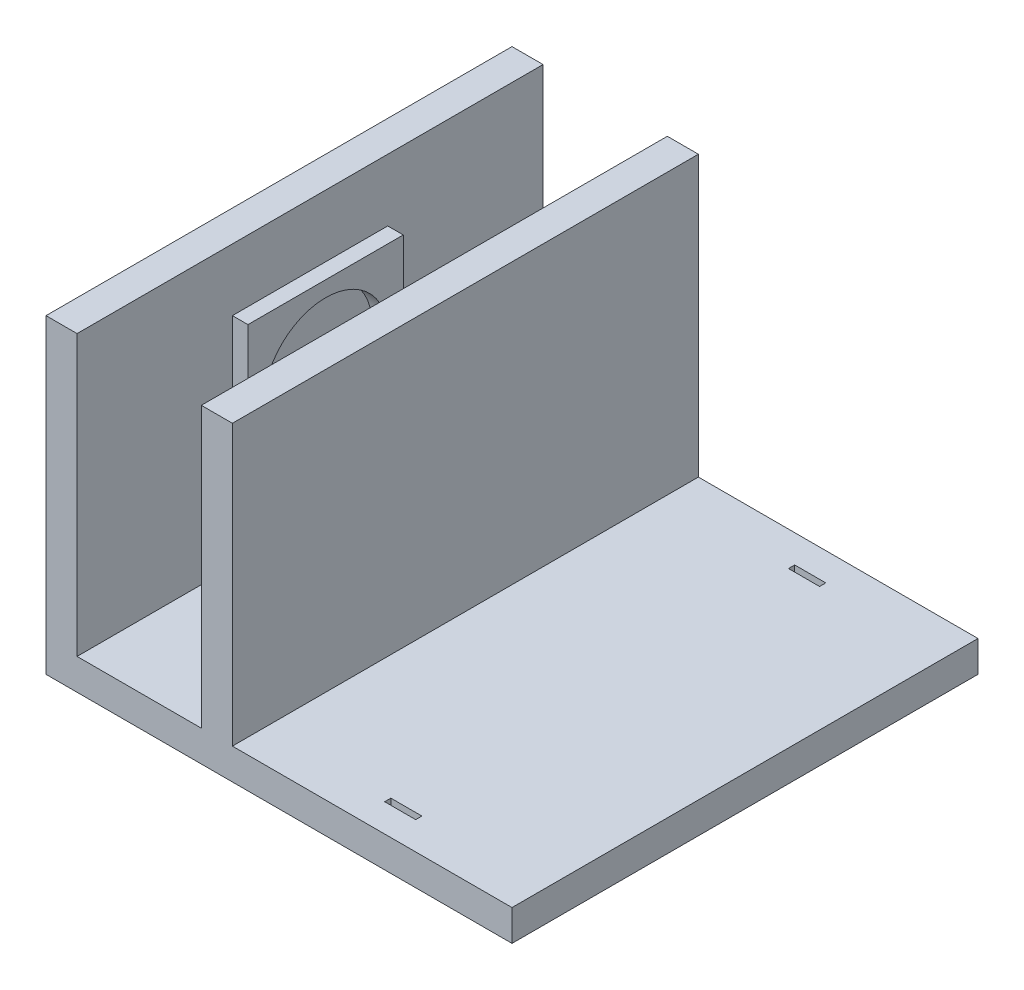
ISO-10303-21;
HEADER;
FILE_DESCRIPTION(('STEP AP214'),'2;1');
FILE_NAME('part.step','',(''),(''),'','','');
FILE_SCHEMA(('AUTOMOTIVE_DESIGN { 1 0 10303 214 1 1 1 1 }'));
ENDSEC;
DATA;
#1=APPLICATION_CONTEXT('core data for automotive mechanical design processes');
#2=APPLICATION_PROTOCOL_DEFINITION('international standard','automotive_design',2000,#1);
#3=PRODUCT_CONTEXT('',#1,'mechanical');
#4=PRODUCT('Part','Part','',(#3));
#5=PRODUCT_RELATED_PRODUCT_CATEGORY('part','',(#4));
#6=PRODUCT_DEFINITION_FORMATION('','',#4);
#7=PRODUCT_DEFINITION_CONTEXT('part definition',#1,'design');
#8=PRODUCT_DEFINITION('design','',#6,#7);
#9=PRODUCT_DEFINITION_SHAPE('','',#8);
#10=(LENGTH_UNIT() NAMED_UNIT(*) SI_UNIT(.MILLI.,.METRE.));
#11=(NAMED_UNIT(*) PLANE_ANGLE_UNIT() SI_UNIT($,.RADIAN.));
#12=(NAMED_UNIT(*) SI_UNIT($,.STERADIAN.) SOLID_ANGLE_UNIT());
#13=UNCERTAINTY_MEASURE_WITH_UNIT(LENGTH_MEASURE(1.E-05),#10,'distance_accuracy_value','');
#14=(GEOMETRIC_REPRESENTATION_CONTEXT(3) GLOBAL_UNCERTAINTY_ASSIGNED_CONTEXT((#13)) GLOBAL_UNIT_ASSIGNED_CONTEXT((#10,
#11,#12)) REPRESENTATION_CONTEXT('',''));
#15=CARTESIAN_POINT('',(0.,0.,0.));
#16=DIRECTION('',(0.,0.,1.));
#17=DIRECTION('',(1.,0.,0.));
#18=AXIS2_PLACEMENT_3D('',#15,#16,#17);
#19=CARTESIAN_POINT('',(50.,0.,150.));
#20=DIRECTION('',(-1.,0.,0.));
#21=DIRECTION('',(0.,0.,1.));
#22=AXIS2_PLACEMENT_3D('',#19,#20,#21);
#23=PLANE('',#22);
#24=DIRECTION('',(0.,1.,0.));
#25=VECTOR('',#24,1.);
#26=CARTESIAN_POINT('',(50.,0.,0.));
#27=LINE('',#26,#25);
#28=CARTESIAN_POINT('',(50.,10.,0.));
#29=VERTEX_POINT('',#28);
#30=CARTESIAN_POINT('',(50.,100.,0.));
#31=VERTEX_POINT('',#30);
#32=EDGE_CURVE('E425',#29,#31,#27,.T.);
#33=ORIENTED_EDGE('',*,*,#32,.F.);
#34=DIRECTION('',(0.,0.,-1.));
#35=VECTOR('',#34,1.);
#36=CARTESIAN_POINT('',(50.,10.,150.));
#37=LINE('',#36,#35);
#38=CARTESIAN_POINT('',(50.,10.,150.));
#39=VERTEX_POINT('',#38);
#40=EDGE_CURVE('E483',#39,#29,#37,.T.);
#41=ORIENTED_EDGE('',*,*,#40,.F.);
#42=DIRECTION('',(0.,1.,0.));
#43=VECTOR('',#42,1.);
#44=CARTESIAN_POINT('',(50.,0.,150.));
#45=LINE('',#44,#43);
#46=CARTESIAN_POINT('',(50.,100.,150.));
#47=VERTEX_POINT('',#46);
#48=EDGE_CURVE('E389',#39,#47,#45,.T.);
#49=ORIENTED_EDGE('',*,*,#48,.T.);
#50=DIRECTION('',(0.,0.,-1.));
#51=VECTOR('',#50,1.);
#52=CARTESIAN_POINT('',(50.,100.,150.));
#53=LINE('',#52,#51);
#54=EDGE_CURVE('E50',#47,#31,#53,.T.);
#55=ORIENTED_EDGE('',*,*,#54,.T.);
#56=EDGE_LOOP('',(#33,#41,#49,#55));
#57=FACE_BOUND('',#56,.T.);
#58=DIRECTION('',(0.,1.,0.));
#59=VECTOR('',#58,1.);
#60=CARTESIAN_POINT('',(50.,0.,100.));
#61=LINE('',#60,#59);
#62=CARTESIAN_POINT('',(50.,30.,100.));
#63=VERTEX_POINT('',#62);
#64=CARTESIAN_POINT('',(50.,80.,100.));
#65=VERTEX_POINT('',#64);
#66=EDGE_CURVE('E916',#63,#65,#61,.T.);
#67=ORIENTED_EDGE('',*,*,#66,.F.);
#68=DIRECTION('',(0.,0.,1.));
#69=VECTOR('',#68,1.);
#70=CARTESIAN_POINT('',(50.,30.,0.));
#71=LINE('',#70,#69);
#72=CARTESIAN_POINT('',(50.,30.,50.));
#73=VERTEX_POINT('',#72);
#74=EDGE_CURVE('E240',#73,#63,#71,.T.);
#75=ORIENTED_EDGE('',*,*,#74,.F.);
#76=DIRECTION('',(0.,-1.,0.));
#77=VECTOR('',#76,1.);
#78=CARTESIAN_POINT('',(50.,0.,50.));
#79=LINE('',#78,#77);
#80=CARTESIAN_POINT('',(50.,80.,50.));
#81=VERTEX_POINT('',#80);
#82=EDGE_CURVE('E907',#81,#73,#79,.T.);
#83=ORIENTED_EDGE('',*,*,#82,.F.);
#84=DIRECTION('',(0.,0.,-1.));
#85=VECTOR('',#84,1.);
#86=CARTESIAN_POINT('',(50.,80.,0.));
#87=LINE('',#86,#85);
#88=EDGE_CURVE('E919',#65,#81,#87,.T.);
#89=ORIENTED_EDGE('',*,*,#88,.F.);
#90=EDGE_LOOP('',(#67,#75,#83,#89));
#91=FACE_BOUND('',#90,.T.);
#92=ADVANCED_FACE('F41',(#57,#91),#23,.T.);
#93=CARTESIAN_POINT('',(10.,0.,150.));
#94=DIRECTION('',(-1.,0.,0.));
#95=DIRECTION('',(0.,0.,1.));
#96=AXIS2_PLACEMENT_3D('',#93,#94,#95);
#97=PLANE('',#96);
#98=DIRECTION('',(0.,1.,0.));
#99=VECTOR('',#98,1.);
#100=CARTESIAN_POINT('',(10.,0.,0.));
#101=LINE('',#100,#99);
#102=CARTESIAN_POINT('',(10.,10.,0.));
#103=VERTEX_POINT('',#102);
#104=CARTESIAN_POINT('',(10.,100.,0.));
#105=VERTEX_POINT('',#104);
#106=EDGE_CURVE('E433',#103,#105,#101,.T.);
#107=ORIENTED_EDGE('',*,*,#106,.T.);
#108=DIRECTION('',(0.,0.,-1.));
#109=VECTOR('',#108,1.);
#110=CARTESIAN_POINT('',(10.,100.,150.));
#111=LINE('',#110,#109);
#112=CARTESIAN_POINT('',(10.,100.,150.));
#113=VERTEX_POINT('',#112);
#114=EDGE_CURVE('E477',#113,#105,#111,.T.);
#115=ORIENTED_EDGE('',*,*,#114,.F.);
#116=DIRECTION('',(0.,1.,0.));
#117=VECTOR('',#116,1.);
#118=CARTESIAN_POINT('',(10.,0.,150.));
#119=LINE('',#118,#117);
#120=CARTESIAN_POINT('',(10.,10.,150.));
#121=VERTEX_POINT('',#120);
#122=EDGE_CURVE('E398',#121,#113,#119,.T.);
#123=ORIENTED_EDGE('',*,*,#122,.F.);
#124=DIRECTION('',(0.,0.,-1.));
#125=VECTOR('',#124,1.);
#126=CARTESIAN_POINT('',(10.,10.,150.));
#127=LINE('',#126,#125);
#128=EDGE_CURVE('E480',#121,#103,#127,.T.);
#129=ORIENTED_EDGE('',*,*,#128,.T.);
#130=EDGE_LOOP('',(#107,#115,#123,#129));
#131=FACE_BOUND('',#130,.T.);
#132=DIRECTION('',(0.,0.,-1.));
#133=VECTOR('',#132,1.);
#134=CARTESIAN_POINT('',(10.,30.,0.));
#135=LINE('',#134,#133);
#136=CARTESIAN_POINT('',(10.,30.,100.));
#137=VERTEX_POINT('',#136);
#138=CARTESIAN_POINT('',(10.,30.,50.));
#139=VERTEX_POINT('',#138);
#140=EDGE_CURVE('E248',#137,#139,#135,.T.);
#141=ORIENTED_EDGE('',*,*,#140,.F.);
#142=DIRECTION('',(0.,1.,0.));
#143=VECTOR('',#142,1.);
#144=CARTESIAN_POINT('',(10.,0.,100.));
#145=LINE('',#144,#143);
#146=CARTESIAN_POINT('',(10.,80.,100.));
#147=VERTEX_POINT('',#146);
#148=EDGE_CURVE('E258',#137,#147,#145,.T.);
#149=ORIENTED_EDGE('',*,*,#148,.T.);
#150=DIRECTION('',(0.,0.,-1.));
#151=VECTOR('',#150,1.);
#152=CARTESIAN_POINT('',(10.,80.,0.));
#153=LINE('',#152,#151);
#154=CARTESIAN_POINT('',(10.,80.,50.));
#155=VERTEX_POINT('',#154);
#156=EDGE_CURVE('E65',#147,#155,#153,.T.);
#157=ORIENTED_EDGE('',*,*,#156,.T.);
#158=DIRECTION('',(0.,1.,0.));
#159=VECTOR('',#158,1.);
#160=CARTESIAN_POINT('',(10.,0.,50.));
#161=LINE('',#160,#159);
#162=EDGE_CURVE('E277',#139,#155,#161,.T.);
#163=ORIENTED_EDGE('',*,*,#162,.F.);
#164=EDGE_LOOP('',(#141,#149,#157,#163));
#165=FACE_BOUND('',#164,.T.);
#166=ADVANCED_FACE('F535',(#131,#165),#97,.F.);
#167=CARTESIAN_POINT('',(0.,0.,150.));
#168=DIRECTION('',(0.,1.,0.));
#169=DIRECTION('',(0.,0.,1.));
#170=AXIS2_PLACEMENT_3D('',#167,#168,#169);
#171=PLANE('',#170);
#172=DIRECTION('',(1.,0.,0.));
#173=VECTOR('',#172,1.);
#174=CARTESIAN_POINT('',(0.,0.,0.));
#175=LINE('',#174,#173);
#176=CARTESIAN_POINT('',(0.,0.,0.));
#177=VERTEX_POINT('',#176);
#178=CARTESIAN_POINT('',(150.,0.,0.));
#179=VERTEX_POINT('',#178);
#180=EDGE_CURVE('E445',#177,#179,#175,.T.);
#181=ORIENTED_EDGE('',*,*,#180,.T.);
#182=DIRECTION('',(0.,0.,-1.));
#183=VECTOR('',#182,1.);
#184=CARTESIAN_POINT('',(150.,0.,150.));
#185=LINE('',#184,#183);
#186=CARTESIAN_POINT('',(150.,0.,150.));
#187=VERTEX_POINT('',#186);
#188=EDGE_CURVE('E467',#187,#179,#185,.T.);
#189=ORIENTED_EDGE('',*,*,#188,.F.);
#190=DIRECTION('',(1.,0.,0.));
#191=VECTOR('',#190,1.);
#192=CARTESIAN_POINT('',(0.,0.,150.));
#193=LINE('',#192,#191);
#194=CARTESIAN_POINT('',(0.,0.,150.));
#195=VERTEX_POINT('',#194);
#196=EDGE_CURVE('E409',#195,#187,#193,.T.);
#197=ORIENTED_EDGE('',*,*,#196,.F.);
#198=DIRECTION('',(0.,0.,-1.));
#199=VECTOR('',#198,1.);
#200=CARTESIAN_POINT('',(0.,0.,150.));
#201=LINE('',#200,#199);
#202=EDGE_CURVE('E471',#195,#177,#201,.T.);
#203=ORIENTED_EDGE('',*,*,#202,.T.);
#204=EDGE_LOOP('',(#181,#189,#197,#203));
#205=FACE_BOUND('',#204,.T.);
#206=DIRECTION('',(-1.,0.,0.));
#207=VECTOR('',#206,1.);
#208=CARTESIAN_POINT('',(110.,0.,141.));
#209=LINE('',#208,#207);
#210=CARTESIAN_POINT('',(110.,0.,141.));
#211=VERTEX_POINT('',#210);
#212=CARTESIAN_POINT('',(100.,0.,141.));
#213=VERTEX_POINT('',#212);
#214=EDGE_CURVE('E348',#211,#213,#209,.T.);
#215=ORIENTED_EDGE('',*,*,#214,.F.);
#216=DIRECTION('',(0.,0.,-1.));
#217=VECTOR('',#216,1.);
#218=CARTESIAN_POINT('',(110.,0.,141.));
#219=LINE('',#218,#217);
#220=CARTESIAN_POINT('',(110.,0.,139.));
#221=VERTEX_POINT('',#220);
#222=EDGE_CURVE('E362',#211,#221,#219,.T.);
#223=ORIENTED_EDGE('',*,*,#222,.T.);
#224=DIRECTION('',(-1.,0.,0.));
#225=VECTOR('',#224,1.);
#226=CARTESIAN_POINT('',(110.,0.,139.));
#227=LINE('',#226,#225);
#228=CARTESIAN_POINT('',(100.,0.,139.));
#229=VERTEX_POINT('',#228);
#230=EDGE_CURVE('E378',#221,#229,#227,.T.);
#231=ORIENTED_EDGE('',*,*,#230,.T.);
#232=DIRECTION('',(0.,0.,-1.));
#233=VECTOR('',#232,1.);
#234=CARTESIAN_POINT('',(100.,0.,141.));
#235=LINE('',#234,#233);
#236=EDGE_CURVE('E374',#213,#229,#235,.T.);
#237=ORIENTED_EDGE('',*,*,#236,.F.);
#238=EDGE_LOOP('',(#215,#223,#231,#237));
#239=FACE_BOUND('',#238,.T.);
#240=DIRECTION('',(0.,0.,1.));
#241=VECTOR('',#240,1.);
#242=CARTESIAN_POINT('',(110.,0.,0.));
#243=LINE('',#242,#241);
#244=CARTESIAN_POINT('',(110.,0.,9.00000000000001));
#245=VERTEX_POINT('',#244);
#246=CARTESIAN_POINT('',(110.,0.,11.));
#247=VERTEX_POINT('',#246);
#248=EDGE_CURVE('E298',#245,#247,#243,.T.);
#249=ORIENTED_EDGE('',*,*,#248,.F.);
#250=DIRECTION('',(-1.,0.,0.));
#251=VECTOR('',#250,1.);
#252=CARTESIAN_POINT('',(0.,0.,9.00000000000002));
#253=LINE('',#252,#251);
#254=CARTESIAN_POINT('',(100.,0.,9.00000000000002));
#255=VERTEX_POINT('',#254);
#256=EDGE_CURVE('E301',#245,#255,#253,.T.);
#257=ORIENTED_EDGE('',*,*,#256,.T.);
#258=DIRECTION('',(0.,0.,1.));
#259=VECTOR('',#258,1.);
#260=CARTESIAN_POINT('',(100.,0.,0.));
#261=LINE('',#260,#259);
#262=CARTESIAN_POINT('',(100.,0.,11.));
#263=VERTEX_POINT('',#262);
#264=EDGE_CURVE('E306',#255,#263,#261,.T.);
#265=ORIENTED_EDGE('',*,*,#264,.T.);
#266=DIRECTION('',(-1.,0.,0.));
#267=VECTOR('',#266,1.);
#268=CARTESIAN_POINT('',(0.,0.,11.));
#269=LINE('',#268,#267);
#270=EDGE_CURVE('E310',#247,#263,#269,.T.);
#271=ORIENTED_EDGE('',*,*,#270,.F.);
#272=EDGE_LOOP('',(#249,#257,#265,#271));
#273=FACE_BOUND('',#272,.T.);
#274=ADVANCED_FACE('F523',(#205,#239,#273),#171,.F.);
#275=CARTESIAN_POINT('',(0.,9.99999999999998,150.));
#276=DIRECTION('',(0.,-1.,0.));
#277=DIRECTION('',(1.,0.,0.));
#278=AXIS2_PLACEMENT_3D('',#275,#276,#277);
#279=PLANE('',#278);
#280=DIRECTION('',(-1.,0.,0.));
#281=VECTOR('',#280,1.);
#282=CARTESIAN_POINT('',(0.,9.99999999999998,0.));
#283=LINE('',#282,#281);
#284=CARTESIAN_POINT('',(150.,10.,0.));
#285=VERTEX_POINT('',#284);
#286=CARTESIAN_POINT('',(60.,9.99999999999999,0.));
#287=VERTEX_POINT('',#286);
#288=EDGE_CURVE('E451',#285,#287,#283,.T.);
#289=ORIENTED_EDGE('',*,*,#288,.T.);
#290=DIRECTION('',(0.,0.,-1.));
#291=VECTOR('',#290,1.);
#292=CARTESIAN_POINT('',(60.,9.99999999999999,150.));
#293=LINE('',#292,#291);
#294=CARTESIAN_POINT('',(60.,9.99999999999999,150.));
#295=VERTEX_POINT('',#294);
#296=EDGE_CURVE('E459',#295,#287,#293,.T.);
#297=ORIENTED_EDGE('',*,*,#296,.F.);
#298=DIRECTION('',(-1.,0.,0.));
#299=VECTOR('',#298,1.);
#300=CARTESIAN_POINT('',(0.,9.99999999999998,150.));
#301=LINE('',#300,#299);
#302=CARTESIAN_POINT('',(150.,10.,150.));
#303=VERTEX_POINT('',#302);
#304=EDGE_CURVE('E415',#303,#295,#301,.T.);
#305=ORIENTED_EDGE('',*,*,#304,.F.);
#306=DIRECTION('',(0.,0.,-1.));
#307=VECTOR('',#306,1.);
#308=CARTESIAN_POINT('',(150.,10.,150.));
#309=LINE('',#308,#307);
#310=EDGE_CURVE('E463',#303,#285,#309,.T.);
#311=ORIENTED_EDGE('',*,*,#310,.T.);
#312=EDGE_LOOP('',(#289,#297,#305,#311));
#313=FACE_BOUND('',#312,.T.);
#314=DIRECTION('',(-1.,0.,0.));
#315=VECTOR('',#314,1.);
#316=CARTESIAN_POINT('',(110.,9.99999999999999,139.));
#317=LINE('',#316,#315);
#318=CARTESIAN_POINT('',(110.,9.99999999999999,139.));
#319=VERTEX_POINT('',#318);
#320=CARTESIAN_POINT('',(100.,9.99999999999999,139.));
#321=VERTEX_POINT('',#320);
#322=EDGE_CURVE('E366',#319,#321,#317,.T.);
#323=ORIENTED_EDGE('',*,*,#322,.F.);
#324=DIRECTION('',(0.,0.,-1.));
#325=VECTOR('',#324,1.);
#326=CARTESIAN_POINT('',(110.,9.99999999999999,141.));
#327=LINE('',#326,#325);
#328=CARTESIAN_POINT('',(110.,9.99999999999999,141.));
#329=VERTEX_POINT('',#328);
#330=EDGE_CURVE('E319',#329,#319,#327,.T.);
#331=ORIENTED_EDGE('',*,*,#330,.F.);
#332=DIRECTION('',(-1.,0.,0.));
#333=VECTOR('',#332,1.);
#334=CARTESIAN_POINT('',(110.,9.99999999999999,141.));
#335=LINE('',#334,#333);
#336=CARTESIAN_POINT('',(100.,9.99999999999999,141.));
#337=VERTEX_POINT('',#336);
#338=EDGE_CURVE('E357',#329,#337,#335,.T.);
#339=ORIENTED_EDGE('',*,*,#338,.T.);
#340=DIRECTION('',(0.,0.,-1.));
#341=VECTOR('',#340,1.);
#342=CARTESIAN_POINT('',(100.,9.99999999999999,141.));
#343=LINE('',#342,#341);
#344=EDGE_CURVE('E361',#337,#321,#343,.T.);
#345=ORIENTED_EDGE('',*,*,#344,.T.);
#346=EDGE_LOOP('',(#323,#331,#339,#345));
#347=FACE_BOUND('',#346,.T.);
#348=DIRECTION('',(0.,0.,1.));
#349=VECTOR('',#348,1.);
#350=CARTESIAN_POINT('',(110.,9.99999999999999,0.));
#351=LINE('',#350,#349);
#352=CARTESIAN_POINT('',(110.,9.99999999999999,9.00000000000002));
#353=VERTEX_POINT('',#352);
#354=CARTESIAN_POINT('',(110.,9.99999999999999,11.));
#355=VERTEX_POINT('',#354);
#356=EDGE_CURVE('E314',#353,#355,#351,.T.);
#357=ORIENTED_EDGE('',*,*,#356,.T.);
#358=DIRECTION('',(-1.,0.,0.));
#359=VECTOR('',#358,1.);
#360=CARTESIAN_POINT('',(0.,9.99999999999998,11.));
#361=LINE('',#360,#359);
#362=CARTESIAN_POINT('',(100.,9.99999999999999,11.));
#363=VERTEX_POINT('',#362);
#364=EDGE_CURVE('E302',#355,#363,#361,.T.);
#365=ORIENTED_EDGE('',*,*,#364,.T.);
#366=DIRECTION('',(0.,0.,1.));
#367=VECTOR('',#366,1.);
#368=CARTESIAN_POINT('',(100.,9.99999999999999,0.));
#369=LINE('',#368,#367);
#370=CARTESIAN_POINT('',(100.,9.99999999999999,9.00000000000001));
#371=VERTEX_POINT('',#370);
#372=EDGE_CURVE('E323',#371,#363,#369,.T.);
#373=ORIENTED_EDGE('',*,*,#372,.F.);
#374=DIRECTION('',(-1.,0.,0.));
#375=VECTOR('',#374,1.);
#376=CARTESIAN_POINT('',(0.,9.99999999999998,9.00000000000002));
#377=LINE('',#376,#375);
#378=EDGE_CURVE('E318',#353,#371,#377,.T.);
#379=ORIENTED_EDGE('',*,*,#378,.F.);
#380=EDGE_LOOP('',(#357,#365,#373,#379));
#381=FACE_BOUND('',#380,.T.);
#382=ADVANCED_FACE('F514',(#313,#347,#381),#279,.F.);
#383=CARTESIAN_POINT('',(0.,100.,150.));
#384=DIRECTION('',(0.,1.,0.));
#385=DIRECTION('',(0.,0.,1.));
#386=AXIS2_PLACEMENT_3D('',#383,#384,#385);
#387=PLANE('',#386);
#388=DIRECTION('',(1.,0.,0.));
#389=VECTOR('',#388,1.);
#390=CARTESIAN_POINT('',(0.,100.,0.));
#391=LINE('',#390,#389);
#392=CARTESIAN_POINT('',(60.,100.,0.));
#393=VERTEX_POINT('',#392);
#394=EDGE_CURVE('E334',#31,#393,#391,.T.);
#395=ORIENTED_EDGE('',*,*,#394,.F.);
#396=ORIENTED_EDGE('',*,*,#54,.F.);
#397=DIRECTION('',(1.,0.,0.));
#398=VECTOR('',#397,1.);
#399=CARTESIAN_POINT('',(0.,100.,150.));
#400=LINE('',#399,#398);
#401=CARTESIAN_POINT('',(60.,100.,150.));
#402=VERTEX_POINT('',#401);
#403=EDGE_CURVE('E385',#47,#402,#400,.T.);
#404=ORIENTED_EDGE('',*,*,#403,.T.);
#405=DIRECTION('',(0.,0.,-1.));
#406=VECTOR('',#405,1.);
#407=CARTESIAN_POINT('',(60.,100.,150.));
#408=LINE('',#407,#406);
#409=EDGE_CURVE('E421',#402,#393,#408,.T.);
#410=ORIENTED_EDGE('',*,*,#409,.T.);
#411=EDGE_LOOP('',(#395,#396,#404,#410));
#412=FACE_BOUND('',#411,.T.);
#413=ADVANCED_FACE('F43',(#412),#387,.T.);
#414=CARTESIAN_POINT('',(0.,10.,150.));
#415=DIRECTION('',(0.,1.,0.));
#416=DIRECTION('',(0.,0.,1.));
#417=AXIS2_PLACEMENT_3D('',#414,#415,#416);
#418=PLANE('',#417);
#419=DIRECTION('',(1.,0.,0.));
#420=VECTOR('',#419,1.);
#421=CARTESIAN_POINT('',(0.,10.,0.));
#422=LINE('',#421,#420);
#423=EDGE_CURVE('E429',#103,#29,#422,.T.);
#424=ORIENTED_EDGE('',*,*,#423,.F.);
#425=ORIENTED_EDGE('',*,*,#128,.F.);
#426=DIRECTION('',(1.,0.,0.));
#427=VECTOR('',#426,1.);
#428=CARTESIAN_POINT('',(0.,10.,150.));
#429=LINE('',#428,#427);
#430=EDGE_CURVE('E394',#121,#39,#429,.T.);
#431=ORIENTED_EDGE('',*,*,#430,.T.);
#432=ORIENTED_EDGE('',*,*,#40,.T.);
#433=EDGE_LOOP('',(#424,#425,#431,#432));
#434=FACE_BOUND('',#433,.T.);
#435=ADVANCED_FACE('F500',(#434),#418,.T.);
#436=CARTESIAN_POINT('',(0.,100.,150.));
#437=DIRECTION('',(0.,1.,0.));
#438=DIRECTION('',(0.,0.,1.));
#439=AXIS2_PLACEMENT_3D('',#436,#437,#438);
#440=PLANE('',#439);
#441=DIRECTION('',(1.,0.,0.));
#442=VECTOR('',#441,1.);
#443=CARTESIAN_POINT('',(0.,100.,0.));
#444=LINE('',#443,#442);
#445=CARTESIAN_POINT('',(0.,100.,0.));
#446=VERTEX_POINT('',#445);
#447=EDGE_CURVE('E437',#446,#105,#444,.T.);
#448=ORIENTED_EDGE('',*,*,#447,.F.);
#449=DIRECTION('',(0.,0.,-1.));
#450=VECTOR('',#449,1.);
#451=CARTESIAN_POINT('',(0.,100.,150.));
#452=LINE('',#451,#450);
#453=CARTESIAN_POINT('',(0.,100.,150.));
#454=VERTEX_POINT('',#453);
#455=EDGE_CURVE('E474',#454,#446,#452,.T.);
#456=ORIENTED_EDGE('',*,*,#455,.F.);
#457=DIRECTION('',(1.,0.,0.));
#458=VECTOR('',#457,1.);
#459=CARTESIAN_POINT('',(0.,100.,150.));
#460=LINE('',#459,#458);
#461=EDGE_CURVE('E401',#454,#113,#460,.T.);
#462=ORIENTED_EDGE('',*,*,#461,.T.);
#463=ORIENTED_EDGE('',*,*,#114,.T.);
#464=EDGE_LOOP('',(#448,#456,#462,#463));
#465=FACE_BOUND('',#464,.T.);
#466=ADVANCED_FACE('F532',(#465),#440,.T.);
#467=CARTESIAN_POINT('',(0.,0.,150.));
#468=DIRECTION('',(-1.,0.,0.));
#469=DIRECTION('',(0.,0.,1.));
#470=AXIS2_PLACEMENT_3D('',#467,#468,#469);
#471=PLANE('',#470);
#472=CARTESIAN_POINT('',(0.,55.,75.));
#473=DIRECTION('',(1.,0.,0.));
#474=DIRECTION('',(0.,0.,-1.));
#475=AXIS2_PLACEMENT_3D('',#472,#473,#474);
#476=CIRCLE('',#475,1.5);
#477=CARTESIAN_POINT('',(0.,55.,73.5));
#478=VERTEX_POINT('',#477);
#479=EDGE_CURVE('E900',#478,#478,#476,.T.);
#480=ORIENTED_EDGE('',*,*,#479,.T.);
#481=EDGE_LOOP('',(#480));
#482=FACE_BOUND('',#481,.T.);
#483=DIRECTION('',(0.,1.,0.));
#484=VECTOR('',#483,1.);
#485=CARTESIAN_POINT('',(0.,0.,0.));
#486=LINE('',#485,#484);
#487=EDGE_CURVE('E441',#177,#446,#486,.T.);
#488=ORIENTED_EDGE('',*,*,#487,.F.);
#489=ORIENTED_EDGE('',*,*,#202,.F.);
#490=DIRECTION('',(0.,1.,0.));
#491=VECTOR('',#490,1.);
#492=CARTESIAN_POINT('',(0.,0.,150.));
#493=LINE('',#492,#491);
#494=EDGE_CURVE('E405',#195,#454,#493,.T.);
#495=ORIENTED_EDGE('',*,*,#494,.T.);
#496=ORIENTED_EDGE('',*,*,#455,.T.);
#497=EDGE_LOOP('',(#488,#489,#495,#496));
#498=FACE_BOUND('',#497,.T.);
#499=ADVANCED_FACE('F528',(#482,#498),#471,.T.);
#500=CARTESIAN_POINT('',(150.,0.,150.));
#501=DIRECTION('',(-1.,0.,0.));
#502=DIRECTION('',(0.,0.,1.));
#503=AXIS2_PLACEMENT_3D('',#500,#501,#502);
#504=PLANE('',#503);
#505=DIRECTION('',(0.,1.,0.));
#506=VECTOR('',#505,1.);
#507=CARTESIAN_POINT('',(150.,0.,0.));
#508=LINE('',#507,#506);
#509=EDGE_CURVE('E448',#179,#285,#508,.T.);
#510=ORIENTED_EDGE('',*,*,#509,.T.);
#511=ORIENTED_EDGE('',*,*,#310,.F.);
#512=DIRECTION('',(0.,1.,0.));
#513=VECTOR('',#512,1.);
#514=CARTESIAN_POINT('',(150.,0.,150.));
#515=LINE('',#514,#513);
#516=EDGE_CURVE('E412',#187,#303,#515,.T.);
#517=ORIENTED_EDGE('',*,*,#516,.F.);
#518=ORIENTED_EDGE('',*,*,#188,.T.);
#519=EDGE_LOOP('',(#510,#511,#517,#518));
#520=FACE_BOUND('',#519,.T.);
#521=ADVANCED_FACE('F519',(#520),#504,.F.);
#522=CARTESIAN_POINT('',(60.,0.,150.));
#523=DIRECTION('',(-1.,0.,0.));
#524=DIRECTION('',(0.,0.,1.));
#525=AXIS2_PLACEMENT_3D('',#522,#523,#524);
#526=PLANE('',#525);
#527=DIRECTION('',(0.,1.,0.));
#528=VECTOR('',#527,1.);
#529=CARTESIAN_POINT('',(60.,0.,0.));
#530=LINE('',#529,#528);
#531=EDGE_CURVE('E390',#287,#393,#530,.T.);
#532=ORIENTED_EDGE('',*,*,#531,.T.);
#533=ORIENTED_EDGE('',*,*,#409,.F.);
#534=DIRECTION('',(0.,1.,0.));
#535=VECTOR('',#534,1.);
#536=CARTESIAN_POINT('',(60.,0.,150.));
#537=LINE('',#536,#535);
#538=EDGE_CURVE('E418',#295,#402,#537,.T.);
#539=ORIENTED_EDGE('',*,*,#538,.F.);
#540=ORIENTED_EDGE('',*,*,#296,.T.);
#541=EDGE_LOOP('',(#532,#533,#539,#540));
#542=FACE_BOUND('',#541,.T.);
#543=ADVANCED_FACE('F509',(#542),#526,.F.);
#544=CARTESIAN_POINT('',(0.,0.,150.));
#545=DIRECTION('',(0.,0.,1.));
#546=DIRECTION('',(1.,0.,0.));
#547=AXIS2_PLACEMENT_3D('',#544,#545,#546);
#548=PLANE('',#547);
#549=ORIENTED_EDGE('',*,*,#403,.F.);
#550=ORIENTED_EDGE('',*,*,#48,.F.);
#551=ORIENTED_EDGE('',*,*,#430,.F.);
#552=ORIENTED_EDGE('',*,*,#122,.T.);
#553=ORIENTED_EDGE('',*,*,#461,.F.);
#554=ORIENTED_EDGE('',*,*,#494,.F.);
#555=ORIENTED_EDGE('',*,*,#196,.T.);
#556=ORIENTED_EDGE('',*,*,#516,.T.);
#557=ORIENTED_EDGE('',*,*,#304,.T.);
#558=ORIENTED_EDGE('',*,*,#538,.T.);
#559=EDGE_LOOP('',(#549,#550,#551,#552,#553,#554,#555,#556,#557,#558));
#560=FACE_BOUND('',#559,.T.);
#561=ADVANCED_FACE('F504',(#560),#548,.T.);
#562=CARTESIAN_POINT('',(0.,0.,0.));
#563=DIRECTION('',(0.,0.,1.));
#564=DIRECTION('',(1.,0.,0.));
#565=AXIS2_PLACEMENT_3D('',#562,#563,#564);
#566=PLANE('',#565);
#567=ORIENTED_EDGE('',*,*,#394,.T.);
#568=ORIENTED_EDGE('',*,*,#531,.F.);
#569=ORIENTED_EDGE('',*,*,#288,.F.);
#570=ORIENTED_EDGE('',*,*,#509,.F.);
#571=ORIENTED_EDGE('',*,*,#180,.F.);
#572=ORIENTED_EDGE('',*,*,#487,.T.);
#573=ORIENTED_EDGE('',*,*,#447,.T.);
#574=ORIENTED_EDGE('',*,*,#106,.F.);
#575=ORIENTED_EDGE('',*,*,#423,.T.);
#576=ORIENTED_EDGE('',*,*,#32,.T.);
#577=EDGE_LOOP('',(#567,#568,#569,#570,#571,#572,#573,#574,#575,#576));
#578=FACE_BOUND('',#577,.T.);
#579=ADVANCED_FACE('F496',(#578),#566,.F.);
#580=CARTESIAN_POINT('',(110.,0.,141.));
#581=DIRECTION('',(1.,0.,0.));
#582=DIRECTION('',(0.,0.,-1.));
#583=AXIS2_PLACEMENT_3D('',#580,#581,#582);
#584=PLANE('',#583);
#585=ORIENTED_EDGE('',*,*,#330,.T.);
#586=DIRECTION('',(0.,1.,0.));
#587=VECTOR('',#586,1.);
#588=CARTESIAN_POINT('',(110.,0.,139.));
#589=LINE('',#588,#587);
#590=EDGE_CURVE('E344',#221,#319,#589,.T.);
#591=ORIENTED_EDGE('',*,*,#590,.F.);
#592=ORIENTED_EDGE('',*,*,#222,.F.);
#593=DIRECTION('',(0.,1.,0.));
#594=VECTOR('',#593,1.);
#595=CARTESIAN_POINT('',(110.,0.,141.));
#596=LINE('',#595,#594);
#597=EDGE_CURVE('E297',#211,#329,#596,.T.);
#598=ORIENTED_EDGE('',*,*,#597,.T.);
#599=EDGE_LOOP('',(#585,#591,#592,#598));
#600=FACE_BOUND('',#599,.T.);
#601=ADVANCED_FACE('F631',(#600),#584,.F.);
#602=CARTESIAN_POINT('',(110.,0.,141.));
#603=DIRECTION('',(0.,0.,-1.));
#604=DIRECTION('',(-1.,0.,0.));
#605=AXIS2_PLACEMENT_3D('',#602,#603,#604);
#606=PLANE('',#605);
#607=ORIENTED_EDGE('',*,*,#338,.F.);
#608=ORIENTED_EDGE('',*,*,#597,.F.);
#609=ORIENTED_EDGE('',*,*,#214,.T.);
#610=DIRECTION('',(0.,1.,0.));
#611=VECTOR('',#610,1.);
#612=CARTESIAN_POINT('',(100.,0.,141.));
#613=LINE('',#612,#611);
#614=EDGE_CURVE('E352',#213,#337,#613,.T.);
#615=ORIENTED_EDGE('',*,*,#614,.T.);
#616=EDGE_LOOP('',(#607,#608,#609,#615));
#617=FACE_BOUND('',#616,.T.);
#618=ADVANCED_FACE('F634',(#617),#606,.T.);
#619=CARTESIAN_POINT('',(100.,0.,141.));
#620=DIRECTION('',(1.,0.,0.));
#621=DIRECTION('',(0.,1.,0.));
#622=AXIS2_PLACEMENT_3D('',#619,#620,#621);
#623=PLANE('',#622);
#624=ORIENTED_EDGE('',*,*,#344,.F.);
#625=ORIENTED_EDGE('',*,*,#614,.F.);
#626=ORIENTED_EDGE('',*,*,#236,.T.);
#627=DIRECTION('',(0.,1.,0.));
#628=VECTOR('',#627,1.);
#629=CARTESIAN_POINT('',(100.,0.,139.));
#630=LINE('',#629,#628);
#631=EDGE_CURVE('E349',#229,#321,#630,.T.);
#632=ORIENTED_EDGE('',*,*,#631,.T.);
#633=EDGE_LOOP('',(#624,#625,#626,#632));
#634=FACE_BOUND('',#633,.T.);
#635=ADVANCED_FACE('F638',(#634),#623,.T.);
#636=CARTESIAN_POINT('',(110.,0.,139.));
#637=DIRECTION('',(0.,0.,-1.));
#638=DIRECTION('',(-1.,0.,0.));
#639=AXIS2_PLACEMENT_3D('',#636,#637,#638);
#640=PLANE('',#639);
#641=ORIENTED_EDGE('',*,*,#322,.T.);
#642=ORIENTED_EDGE('',*,*,#631,.F.);
#643=ORIENTED_EDGE('',*,*,#230,.F.);
#644=ORIENTED_EDGE('',*,*,#590,.T.);
#645=EDGE_LOOP('',(#641,#642,#643,#644));
#646=FACE_BOUND('',#645,.T.);
#647=ADVANCED_FACE('F629',(#646),#640,.F.);
#648=CARTESIAN_POINT('',(110.,0.,0.));
#649=DIRECTION('',(-1.,0.,0.));
#650=DIRECTION('',(0.,-1.,0.));
#651=AXIS2_PLACEMENT_3D('',#648,#649,#650);
#652=PLANE('',#651);
#653=ORIENTED_EDGE('',*,*,#356,.F.);
#654=DIRECTION('',(0.,1.,0.));
#655=VECTOR('',#654,1.);
#656=CARTESIAN_POINT('',(110.,0.,9.00000000000001));
#657=LINE('',#656,#655);
#658=EDGE_CURVE('E313',#245,#353,#657,.T.);
#659=ORIENTED_EDGE('',*,*,#658,.F.);
#660=ORIENTED_EDGE('',*,*,#248,.T.);
#661=DIRECTION('',(0.,1.,0.));
#662=VECTOR('',#661,1.);
#663=CARTESIAN_POINT('',(110.,0.,11.));
#664=LINE('',#663,#662);
#665=EDGE_CURVE('E330',#247,#355,#664,.T.);
#666=ORIENTED_EDGE('',*,*,#665,.T.);
#667=EDGE_LOOP('',(#653,#659,#660,#666));
#668=FACE_BOUND('',#667,.T.);
#669=ADVANCED_FACE('F619',(#668),#652,.T.);
#670=CARTESIAN_POINT('',(0.,0.,11.));
#671=DIRECTION('',(0.,0.,-1.));
#672=DIRECTION('',(-1.,0.,0.));
#673=AXIS2_PLACEMENT_3D('',#670,#671,#672);
#674=PLANE('',#673);
#675=ORIENTED_EDGE('',*,*,#364,.F.);
#676=ORIENTED_EDGE('',*,*,#665,.F.);
#677=ORIENTED_EDGE('',*,*,#270,.T.);
#678=DIRECTION('',(0.,1.,0.));
#679=VECTOR('',#678,1.);
#680=CARTESIAN_POINT('',(100.,0.,11.));
#681=LINE('',#680,#679);
#682=EDGE_CURVE('E335',#263,#363,#681,.T.);
#683=ORIENTED_EDGE('',*,*,#682,.T.);
#684=EDGE_LOOP('',(#675,#676,#677,#683));
#685=FACE_BOUND('',#684,.T.);
#686=ADVANCED_FACE('F615',(#685),#674,.T.);
#687=CARTESIAN_POINT('',(100.,0.,0.));
#688=DIRECTION('',(-1.,0.,0.));
#689=DIRECTION('',(0.,-1.,0.));
#690=AXIS2_PLACEMENT_3D('',#687,#688,#689);
#691=PLANE('',#690);
#692=ORIENTED_EDGE('',*,*,#372,.T.);
#693=ORIENTED_EDGE('',*,*,#682,.F.);
#694=ORIENTED_EDGE('',*,*,#264,.F.);
#695=DIRECTION('',(0.,1.,0.));
#696=VECTOR('',#695,1.);
#697=CARTESIAN_POINT('',(100.,0.,9.00000000000001));
#698=LINE('',#697,#696);
#699=EDGE_CURVE('E338',#255,#371,#698,.T.);
#700=ORIENTED_EDGE('',*,*,#699,.T.);
#701=EDGE_LOOP('',(#692,#693,#694,#700));
#702=FACE_BOUND('',#701,.T.);
#703=ADVANCED_FACE('F618',(#702),#691,.F.);
#704=CARTESIAN_POINT('',(0.,0.,9.00000000000002));
#705=DIRECTION('',(0.,0.,-1.));
#706=DIRECTION('',(-1.,0.,0.));
#707=AXIS2_PLACEMENT_3D('',#704,#705,#706);
#708=PLANE('',#707);
#709=ORIENTED_EDGE('',*,*,#378,.T.);
#710=ORIENTED_EDGE('',*,*,#699,.F.);
#711=ORIENTED_EDGE('',*,*,#256,.F.);
#712=ORIENTED_EDGE('',*,*,#658,.T.);
#713=EDGE_LOOP('',(#709,#710,#711,#712));
#714=FACE_BOUND('',#713,.T.);
#715=ADVANCED_FACE('F565',(#714),#708,.F.);
#716=CARTESIAN_POINT('',(15.,30.,0.));
#717=DIRECTION('',(0.,1.,0.));
#718=DIRECTION('',(0.,0.,1.));
#719=AXIS2_PLACEMENT_3D('',#716,#717,#718);
#720=PLANE('',#719);
#721=ORIENTED_EDGE('',*,*,#140,.T.);
#722=DIRECTION('',(-1.,0.,0.));
#723=VECTOR('',#722,1.);
#724=CARTESIAN_POINT('',(15.,30.,50.));
#725=LINE('',#724,#723);
#726=CARTESIAN_POINT('',(15.,30.,50.));
#727=VERTEX_POINT('',#726);
#728=EDGE_CURVE('E294',#727,#139,#725,.T.);
#729=ORIENTED_EDGE('',*,*,#728,.F.);
#730=DIRECTION('',(0.,0.,-1.));
#731=VECTOR('',#730,1.);
#732=CARTESIAN_POINT('',(15.,30.,0.));
#733=LINE('',#732,#731);
#734=CARTESIAN_POINT('',(15.,30.,100.));
#735=VERTEX_POINT('',#734);
#736=EDGE_CURVE('E257',#735,#727,#733,.T.);
#737=ORIENTED_EDGE('',*,*,#736,.F.);
#738=DIRECTION('',(-1.,0.,0.));
#739=VECTOR('',#738,1.);
#740=CARTESIAN_POINT('',(15.,30.,100.));
#741=LINE('',#740,#739);
#742=EDGE_CURVE('E272',#735,#137,#741,.T.);
#743=ORIENTED_EDGE('',*,*,#742,.T.);
#744=EDGE_LOOP('',(#721,#729,#737,#743));
#745=FACE_BOUND('',#744,.T.);
#746=ADVANCED_FACE('F545',(#745),#720,.F.);
#747=CARTESIAN_POINT('',(15.,0.,50.));
#748=DIRECTION('',(0.,0.,1.));
#749=DIRECTION('',(1.,0.,0.));
#750=AXIS2_PLACEMENT_3D('',#747,#748,#749);
#751=PLANE('',#750);
#752=ORIENTED_EDGE('',*,*,#162,.T.);
#753=DIRECTION('',(-1.,0.,0.));
#754=VECTOR('',#753,1.);
#755=CARTESIAN_POINT('',(15.,80.,50.));
#756=LINE('',#755,#754);
#757=CARTESIAN_POINT('',(15.,80.,50.));
#758=VERTEX_POINT('',#757);
#759=EDGE_CURVE('E291',#758,#155,#756,.T.);
#760=ORIENTED_EDGE('',*,*,#759,.F.);
#761=DIRECTION('',(0.,1.,0.));
#762=VECTOR('',#761,1.);
#763=CARTESIAN_POINT('',(15.,0.,50.));
#764=LINE('',#763,#762);
#765=EDGE_CURVE('E262',#727,#758,#764,.T.);
#766=ORIENTED_EDGE('',*,*,#765,.F.);
#767=ORIENTED_EDGE('',*,*,#728,.T.);
#768=EDGE_LOOP('',(#752,#760,#766,#767));
#769=FACE_BOUND('',#768,.T.);
#770=ADVANCED_FACE('F556',(#769),#751,.F.);
#771=CARTESIAN_POINT('',(15.,80.,0.));
#772=DIRECTION('',(0.,1.,0.));
#773=DIRECTION('',(0.,0.,1.));
#774=AXIS2_PLACEMENT_3D('',#771,#772,#773);
#775=PLANE('',#774);
#776=ORIENTED_EDGE('',*,*,#156,.F.);
#777=DIRECTION('',(-1.,0.,0.));
#778=VECTOR('',#777,1.);
#779=CARTESIAN_POINT('',(15.,80.,100.));
#780=LINE('',#779,#778);
#781=CARTESIAN_POINT('',(15.,80.,100.));
#782=VERTEX_POINT('',#781);
#783=EDGE_CURVE('E288',#782,#147,#780,.T.);
#784=ORIENTED_EDGE('',*,*,#783,.F.);
#785=DIRECTION('',(0.,0.,-1.));
#786=VECTOR('',#785,1.);
#787=CARTESIAN_POINT('',(15.,80.,0.));
#788=LINE('',#787,#786);
#789=EDGE_CURVE('E265',#782,#758,#788,.T.);
#790=ORIENTED_EDGE('',*,*,#789,.T.);
#791=ORIENTED_EDGE('',*,*,#759,.T.);
#792=EDGE_LOOP('',(#776,#784,#790,#791));
#793=FACE_BOUND('',#792,.T.);
#794=ADVANCED_FACE('F551',(#793),#775,.T.);
#795=CARTESIAN_POINT('',(15.,55.,75.));
#796=DIRECTION('',(-1.,0.,0.));
#797=DIRECTION('',(0.,0.,1.));
#798=AXIS2_PLACEMENT_3D('',#795,#796,#797);
#799=CYLINDRICAL_SURFACE('',#798,20.);
#800=CARTESIAN_POINT('',(15.,55.,75.));
#801=DIRECTION('',(1.,0.,0.));
#802=DIRECTION('',(0.,0.,-1.));
#803=AXIS2_PLACEMENT_3D('',#800,#801,#802);
#804=CIRCLE('',#803,20.);
#805=CARTESIAN_POINT('',(15.,55.,55.));
#806=VERTEX_POINT('',#805);
#807=EDGE_CURVE('E253',#806,#806,#804,.T.);
#808=ORIENTED_EDGE('',*,*,#807,.T.);
#809=EDGE_LOOP('',(#808));
#810=FACE_BOUND('',#809,.T.);
#811=CARTESIAN_POINT('',(10.,55.,75.));
#812=DIRECTION('',(1.,0.,0.));
#813=DIRECTION('',(0.,0.,-1.));
#814=AXIS2_PLACEMENT_3D('',#811,#812,#813);
#815=CIRCLE('',#814,20.);
#816=CARTESIAN_POINT('',(10.,55.,55.));
#817=VERTEX_POINT('',#816);
#818=EDGE_CURVE('E243',#817,#817,#815,.T.);
#819=ORIENTED_EDGE('',*,*,#818,.F.);
#820=EDGE_LOOP('',(#819));
#821=FACE_BOUND('',#820,.T.);
#822=ADVANCED_FACE('F563',(#810,#821),#799,.F.);
#823=CARTESIAN_POINT('',(15.,0.,100.));
#824=DIRECTION('',(0.,0.,1.));
#825=DIRECTION('',(1.,0.,0.));
#826=AXIS2_PLACEMENT_3D('',#823,#824,#825);
#827=PLANE('',#826);
#828=ORIENTED_EDGE('',*,*,#148,.F.);
#829=ORIENTED_EDGE('',*,*,#742,.F.);
#830=DIRECTION('',(0.,1.,0.));
#831=VECTOR('',#830,1.);
#832=CARTESIAN_POINT('',(15.,0.,100.));
#833=LINE('',#832,#831);
#834=EDGE_CURVE('E269',#735,#782,#833,.T.);
#835=ORIENTED_EDGE('',*,*,#834,.T.);
#836=ORIENTED_EDGE('',*,*,#783,.T.);
#837=EDGE_LOOP('',(#828,#829,#835,#836));
#838=FACE_BOUND('',#837,.T.);
#839=ADVANCED_FACE('F549',(#838),#827,.T.);
#840=CARTESIAN_POINT('',(15.,0.,0.));
#841=DIRECTION('',(1.,0.,0.));
#842=DIRECTION('',(0.,0.,-1.));
#843=AXIS2_PLACEMENT_3D('',#840,#841,#842);
#844=PLANE('',#843);
#845=ORIENTED_EDGE('',*,*,#807,.F.);
#846=EDGE_LOOP('',(#845));
#847=FACE_BOUND('',#846,.T.);
#848=ORIENTED_EDGE('',*,*,#736,.T.);
#849=ORIENTED_EDGE('',*,*,#765,.T.);
#850=ORIENTED_EDGE('',*,*,#789,.F.);
#851=ORIENTED_EDGE('',*,*,#834,.F.);
#852=EDGE_LOOP('',(#848,#849,#850,#851));
#853=FACE_BOUND('',#852,.T.);
#854=ADVANCED_FACE('F553',(#847,#853),#844,.T.);
#855=CARTESIAN_POINT('',(10.,55.,75.));
#856=DIRECTION('',(1.,0.,0.));
#857=DIRECTION('',(0.,0.,-1.));
#858=AXIS2_PLACEMENT_3D('',#855,#856,#857);
#859=CIRCLE('',#858,1.5);
#860=CARTESIAN_POINT('',(10.,55.,73.5));
#861=VERTEX_POINT('',#860);
#862=EDGE_CURVE('E896',#861,#861,#859,.T.);
#863=ORIENTED_EDGE('',*,*,#862,.F.);
#864=EDGE_LOOP('',(#863));
#865=FACE_BOUND('',#864,.T.);
#866=ORIENTED_EDGE('',*,*,#818,.T.);
#867=EDGE_LOOP('',(#866));
#868=FACE_BOUND('',#867,.T.);
#869=ADVANCED_FACE('F539',(#865,#868),#97,.F.);
#870=CARTESIAN_POINT('',(45.,30.,0.));
#871=DIRECTION('',(0.,1.,0.));
#872=DIRECTION('',(0.,0.,1.));
#873=AXIS2_PLACEMENT_3D('',#870,#871,#872);
#874=PLANE('',#873);
#875=ORIENTED_EDGE('',*,*,#74,.T.);
#876=DIRECTION('',(1.,0.,0.));
#877=VECTOR('',#876,1.);
#878=CARTESIAN_POINT('',(45.,30.,100.));
#879=LINE('',#878,#877);
#880=CARTESIAN_POINT('',(45.,30.,100.));
#881=VERTEX_POINT('',#880);
#882=EDGE_CURVE('E219',#881,#63,#879,.T.);
#883=ORIENTED_EDGE('',*,*,#882,.F.);
#884=DIRECTION('',(0.,0.,1.));
#885=VECTOR('',#884,1.);
#886=CARTESIAN_POINT('',(45.,30.,0.));
#887=LINE('',#886,#885);
#888=CARTESIAN_POINT('',(45.,30.,50.));
#889=VERTEX_POINT('',#888);
#890=EDGE_CURVE('E227',#889,#881,#887,.T.);
#891=ORIENTED_EDGE('',*,*,#890,.F.);
#892=DIRECTION('',(1.,0.,0.));
#893=VECTOR('',#892,1.);
#894=CARTESIAN_POINT('',(45.,30.,50.));
#895=LINE('',#894,#893);
#896=EDGE_CURVE('E913',#889,#73,#895,.T.);
#897=ORIENTED_EDGE('',*,*,#896,.T.);
#898=EDGE_LOOP('',(#875,#883,#891,#897));
#899=FACE_BOUND('',#898,.T.);
#900=ADVANCED_FACE('F238',(#899),#874,.F.);
#901=CARTESIAN_POINT('',(45.,0.,100.));
#902=DIRECTION('',(0.,0.,-1.));
#903=DIRECTION('',(-1.,0.,0.));
#904=AXIS2_PLACEMENT_3D('',#901,#902,#903);
#905=PLANE('',#904);
#906=ORIENTED_EDGE('',*,*,#66,.T.);
#907=DIRECTION('',(1.,0.,0.));
#908=VECTOR('',#907,1.);
#909=CARTESIAN_POINT('',(45.,80.,100.));
#910=LINE('',#909,#908);
#911=CARTESIAN_POINT('',(45.,80.,100.));
#912=VERTEX_POINT('',#911);
#913=EDGE_CURVE('E222',#912,#65,#910,.T.);
#914=ORIENTED_EDGE('',*,*,#913,.F.);
#915=DIRECTION('',(0.,1.,0.));
#916=VECTOR('',#915,1.);
#917=CARTESIAN_POINT('',(45.,0.,100.));
#918=LINE('',#917,#916);
#919=EDGE_CURVE('E215',#881,#912,#918,.T.);
#920=ORIENTED_EDGE('',*,*,#919,.F.);
#921=ORIENTED_EDGE('',*,*,#882,.T.);
#922=EDGE_LOOP('',(#906,#914,#920,#921));
#923=FACE_BOUND('',#922,.T.);
#924=ADVANCED_FACE('F217',(#923),#905,.F.);
#925=CARTESIAN_POINT('',(45.,80.,0.));
#926=DIRECTION('',(0.,-1.,0.));
#927=DIRECTION('',(0.,0.,-1.));
#928=AXIS2_PLACEMENT_3D('',#925,#926,#927);
#929=PLANE('',#928);
#930=ORIENTED_EDGE('',*,*,#88,.T.);
#931=DIRECTION('',(1.,0.,0.));
#932=VECTOR('',#931,1.);
#933=CARTESIAN_POINT('',(45.,80.,50.));
#934=LINE('',#933,#932);
#935=CARTESIAN_POINT('',(45.,80.,50.));
#936=VERTEX_POINT('',#935);
#937=EDGE_CURVE('E57',#936,#81,#934,.T.);
#938=ORIENTED_EDGE('',*,*,#937,.F.);
#939=DIRECTION('',(0.,0.,-1.));
#940=VECTOR('',#939,1.);
#941=CARTESIAN_POINT('',(45.,80.,0.));
#942=LINE('',#941,#940);
#943=EDGE_CURVE('E226',#912,#936,#942,.T.);
#944=ORIENTED_EDGE('',*,*,#943,.F.);
#945=ORIENTED_EDGE('',*,*,#913,.T.);
#946=EDGE_LOOP('',(#930,#938,#944,#945));
#947=FACE_BOUND('',#946,.T.);
#948=ADVANCED_FACE('F588',(#947),#929,.F.);
#949=CARTESIAN_POINT('',(45.,55.,75.));
#950=DIRECTION('',(1.,0.,0.));
#951=DIRECTION('',(0.,0.,-1.));
#952=AXIS2_PLACEMENT_3D('',#949,#950,#951);
#953=CYLINDRICAL_SURFACE('',#952,20.);
#954=CARTESIAN_POINT('',(45.,55.,75.));
#955=DIRECTION('',(-1.,0.,0.));
#956=DIRECTION('',(0.,0.,1.));
#957=AXIS2_PLACEMENT_3D('',#954,#955,#956);
#958=CIRCLE('',#957,20.);
#959=CARTESIAN_POINT('',(45.,55.,95.));
#960=VERTEX_POINT('',#959);
#961=EDGE_CURVE('E236',#960,#960,#958,.T.);
#962=ORIENTED_EDGE('',*,*,#961,.T.);
#963=EDGE_LOOP('',(#962));
#964=FACE_BOUND('',#963,.T.);
#965=CARTESIAN_POINT('',(50.,55.,75.));
#966=DIRECTION('',(-1.,0.,0.));
#967=DIRECTION('',(0.,0.,1.));
#968=AXIS2_PLACEMENT_3D('',#965,#966,#967);
#969=CIRCLE('',#968,20.);
#970=CARTESIAN_POINT('',(50.,55.,95.));
#971=VERTEX_POINT('',#970);
#972=EDGE_CURVE('E11',#971,#971,#969,.F.);
#973=ORIENTED_EDGE('',*,*,#972,.T.);
#974=EDGE_LOOP('',(#973));
#975=FACE_BOUND('',#974,.T.);
#976=ADVANCED_FACE('F586',(#964,#975),#953,.F.);
#977=CARTESIAN_POINT('',(45.,0.,50.));
#978=DIRECTION('',(0.,0.,1.));
#979=DIRECTION('',(1.,0.,0.));
#980=AXIS2_PLACEMENT_3D('',#977,#978,#979);
#981=PLANE('',#980);
#982=ORIENTED_EDGE('',*,*,#82,.T.);
#983=ORIENTED_EDGE('',*,*,#896,.F.);
#984=DIRECTION('',(0.,-1.,0.));
#985=VECTOR('',#984,1.);
#986=CARTESIAN_POINT('',(45.,0.,50.));
#987=LINE('',#986,#985);
#988=EDGE_CURVE('E231',#936,#889,#987,.T.);
#989=ORIENTED_EDGE('',*,*,#988,.F.);
#990=ORIENTED_EDGE('',*,*,#937,.T.);
#991=EDGE_LOOP('',(#982,#983,#989,#990));
#992=FACE_BOUND('',#991,.T.);
#993=ADVANCED_FACE('F581',(#992),#981,.F.);
#994=CARTESIAN_POINT('',(45.,0.,0.));
#995=DIRECTION('',(-1.,0.,0.));
#996=DIRECTION('',(0.,0.,1.));
#997=AXIS2_PLACEMENT_3D('',#994,#995,#996);
#998=PLANE('',#997);
#999=ORIENTED_EDGE('',*,*,#961,.F.);
#1000=EDGE_LOOP('',(#999));
#1001=FACE_BOUND('',#1000,.T.);
#1002=ORIENTED_EDGE('',*,*,#890,.T.);
#1003=ORIENTED_EDGE('',*,*,#919,.T.);
#1004=ORIENTED_EDGE('',*,*,#943,.T.);
#1005=ORIENTED_EDGE('',*,*,#988,.T.);
#1006=EDGE_LOOP('',(#1002,#1003,#1004,#1005));
#1007=FACE_BOUND('',#1006,.T.);
#1008=ADVANCED_FACE('F230',(#1001,#1007),#998,.T.);
#1009=ORIENTED_EDGE('',*,*,#972,.F.);
#1010=EDGE_LOOP('',(#1009));
#1011=FACE_BOUND('',#1010,.T.);
#1012=ADVANCED_FACE('F568',(#1011),#23,.T.);
#1013=CARTESIAN_POINT('',(0.,55.,75.));
#1014=DIRECTION('',(1.,0.,0.));
#1015=DIRECTION('',(0.,0.,-1.));
#1016=AXIS2_PLACEMENT_3D('',#1013,#1014,#1015);
#1017=CYLINDRICAL_SURFACE('',#1016,1.5);
#1018=ORIENTED_EDGE('',*,*,#479,.F.);
#1019=EDGE_LOOP('',(#1018));
#1020=FACE_BOUND('',#1019,.T.);
#1021=ORIENTED_EDGE('',*,*,#862,.T.);
#1022=EDGE_LOOP('',(#1021));
#1023=FACE_BOUND('',#1022,.T.);
#1024=ADVANCED_FACE('F573',(#1020,#1023),#1017,.F.);
#1025=CLOSED_SHELL('',(#92,#166,#274,#382,#413,#435,#466,#499,#521,#543,#561,#579,#601,#618,
#635,#647,#669,#686,#703,#715,#746,#770,#794,#822,#839,#854,#869,#900,#924,#948,#976,#993,#1008,
#1012,#1024));
#1026=MANIFOLD_SOLID_BREP('B2',#1025);
#1027=ADVANCED_BREP_SHAPE_REPRESENTATION('',(#18,#1026),#14);
#1028=SHAPE_DEFINITION_REPRESENTATION(#9,#1027);
ENDSEC;
END-ISO-10303-21;
